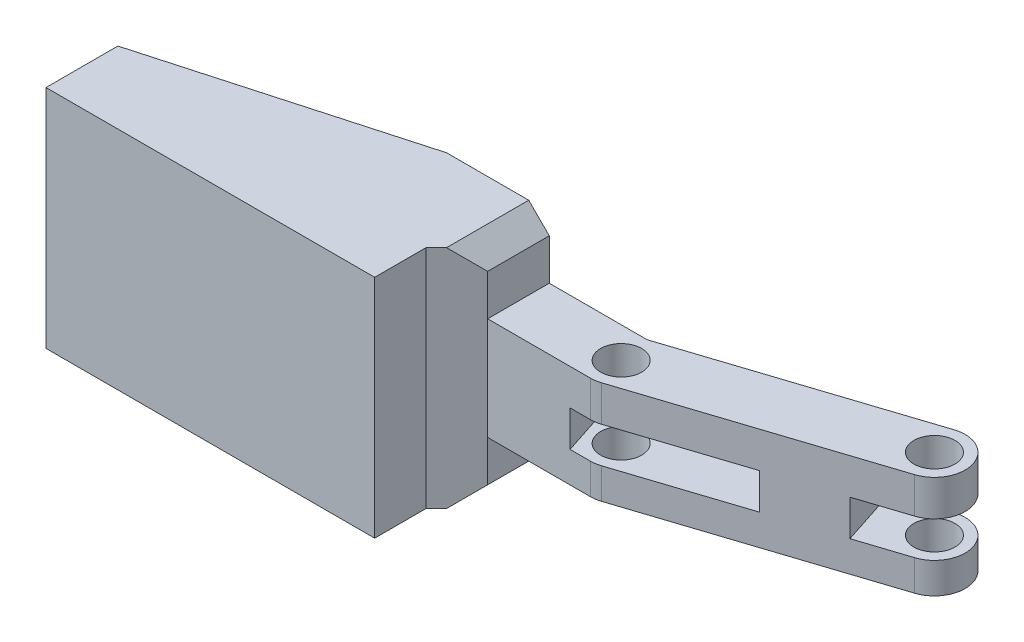
ISO-10303-21;
HEADER;
FILE_DESCRIPTION(('STEP AP214'),'2;1');
FILE_NAME('part.step','',(''),(''),'','','');
FILE_SCHEMA(('AUTOMOTIVE_DESIGN { 1 0 10303 214 1 1 1 1 }'));
ENDSEC;
DATA;
#1=APPLICATION_CONTEXT('core data for automotive mechanical design processes');
#2=APPLICATION_PROTOCOL_DEFINITION('international standard','automotive_design',2000,#1);
#3=PRODUCT_CONTEXT('',#1,'mechanical');
#4=PRODUCT('Part','Part','',(#3));
#5=PRODUCT_RELATED_PRODUCT_CATEGORY('part','',(#4));
#6=PRODUCT_DEFINITION_FORMATION('','',#4);
#7=PRODUCT_DEFINITION_CONTEXT('part definition',#1,'design');
#8=PRODUCT_DEFINITION('design','',#6,#7);
#9=PRODUCT_DEFINITION_SHAPE('','',#8);
#10=(LENGTH_UNIT() NAMED_UNIT(*) SI_UNIT(.MILLI.,.METRE.));
#11=(NAMED_UNIT(*) PLANE_ANGLE_UNIT() SI_UNIT($,.RADIAN.));
#12=(NAMED_UNIT(*) SI_UNIT($,.STERADIAN.) SOLID_ANGLE_UNIT());
#13=UNCERTAINTY_MEASURE_WITH_UNIT(LENGTH_MEASURE(1.E-05),#10,'distance_accuracy_value','');
#14=(GEOMETRIC_REPRESENTATION_CONTEXT(3) GLOBAL_UNCERTAINTY_ASSIGNED_CONTEXT((#13)) GLOBAL_UNIT_ASSIGNED_CONTEXT((#10,
#11,#12)) REPRESENTATION_CONTEXT('',''));
#15=CARTESIAN_POINT('',(0.,0.,0.));
#16=DIRECTION('',(0.,0.,1.));
#17=DIRECTION('',(1.,0.,0.));
#18=AXIS2_PLACEMENT_3D('',#15,#16,#17);
#19=CARTESIAN_POINT('',(-32.5,10.,3.75));
#20=DIRECTION('',(0.,1.,0.));
#21=DIRECTION('',(0.,0.,-1.));
#22=AXIS2_PLACEMENT_3D('',#19,#20,#21);
#23=PLANE('',#22);
#24=CARTESIAN_POINT('',(-23.,10.,7.5));
#25=DIRECTION('',(0.,1.,0.));
#26=DIRECTION('',(1.,0.,0.));
#27=AXIS2_PLACEMENT_3D('',#24,#25,#26);
#28=CIRCLE('',#27,2.);
#29=CARTESIAN_POINT('',(-25.,10.,7.5));
#30=VERTEX_POINT('',#29);
#31=EDGE_CURVE('E309',#30,#30,#28,.T.);
#32=ORIENTED_EDGE('',*,*,#31,.F.);
#33=EDGE_LOOP('',(#32));
#34=FACE_BOUND('',#33,.T.);
#35=CARTESIAN_POINT('',(0.,10.,0.));
#36=DIRECTION('',(0.,1.,0.));
#37=DIRECTION('',(1.,0.,0.));
#38=AXIS2_PLACEMENT_3D('',#35,#36,#37);
#39=CIRCLE('',#38,2.);
#40=CARTESIAN_POINT('',(-2.,10.,0.));
#41=VERTEX_POINT('',#40);
#42=EDGE_CURVE('E168',#41,#41,#39,.T.);
#43=ORIENTED_EDGE('',*,*,#42,.F.);
#44=EDGE_LOOP('',(#43));
#45=FACE_BOUND('',#44,.T.);
#46=DIRECTION('',(0.,0.,-1.));
#47=VECTOR('',#46,1.);
#48=CARTESIAN_POINT('',(-33.,10.,4.125));
#49=LINE('',#48,#47);
#50=CARTESIAN_POINT('',(-33.,10.,10.5));
#51=VERTEX_POINT('',#50);
#52=CARTESIAN_POINT('',(-33.,10.,4.5));
#53=VERTEX_POINT('',#52);
#54=EDGE_CURVE('E217',#51,#53,#49,.T.);
#55=ORIENTED_EDGE('',*,*,#54,.F.);
#56=DIRECTION('',(-1.,0.,0.));
#57=VECTOR('',#56,1.);
#58=CARTESIAN_POINT('',(-23.,10.,10.5));
#59=LINE('',#58,#57);
#60=CARTESIAN_POINT('',(-23.,10.,10.5));
#61=VERTEX_POINT('',#60);
#62=EDGE_CURVE('E272',#61,#51,#59,.T.);
#63=ORIENTED_EDGE('',*,*,#62,.F.);
#64=CARTESIAN_POINT('',(-23.,10.,7.5));
#65=DIRECTION('',(0.,-1.,0.));
#66=DIRECTION('',(0.,0.,-1.));
#67=AXIS2_PLACEMENT_3D('',#64,#65,#66);
#68=CIRCLE('',#67,3.);
#69=CARTESIAN_POINT('',(-22.0699382005073,10.,10.3521895184444));
#70=VERTEX_POINT('',#69);
#71=EDGE_CURVE('E287',#70,#61,#68,.T.);
#72=ORIENTED_EDGE('',*,*,#71,.F.);
#73=DIRECTION('',(-0.950729839481479,0.,0.310020599830917));
#74=VECTOR('',#73,1.);
#75=CARTESIAN_POINT('',(0.93006179949275,10.,2.85218951844443));
#76=LINE('',#75,#74);
#77=CARTESIAN_POINT('',(0.93006179949275,10.,2.85218951844443));
#78=VERTEX_POINT('',#77);
#79=EDGE_CURVE('E11',#78,#70,#76,.T.);
#80=ORIENTED_EDGE('',*,*,#79,.F.);
#81=CARTESIAN_POINT('',(0.,10.,0.));
#82=DIRECTION('',(0.,-1.,0.));
#83=DIRECTION('',(-0.310020599830917,0.,-0.950729839481479));
#84=AXIS2_PLACEMENT_3D('',#81,#82,#83);
#85=CIRCLE('',#84,3.);
#86=CARTESIAN_POINT('',(-0.93006179949275,10.,-2.85218951844443));
#87=VERTEX_POINT('',#86);
#88=EDGE_CURVE('E304',#87,#78,#85,.T.);
#89=ORIENTED_EDGE('',*,*,#88,.F.);
#90=DIRECTION('',(0.950729839481479,0.,-0.310020599830917));
#91=VECTOR('',#90,1.);
#92=CARTESIAN_POINT('',(-23.9300617994928,10.,4.64781048155556));
#93=LINE('',#92,#91);
#94=CARTESIAN_POINT('',(-23.4767763227223,10.,4.5));
#95=VERTEX_POINT('',#94);
#96=EDGE_CURVE('E299',#95,#87,#93,.T.);
#97=ORIENTED_EDGE('',*,*,#96,.F.);
#98=DIRECTION('',(1.,0.,0.));
#99=VECTOR('',#98,1.);
#100=CARTESIAN_POINT('',(-68.,10.,4.5));
#101=LINE('',#100,#99);
#102=EDGE_CURVE('E346',#53,#95,#101,.T.);
#103=ORIENTED_EDGE('',*,*,#102,.F.);
#104=EDGE_LOOP('',(#55,#63,#72,#80,#89,#97,#103));
#105=FACE_BOUND('',#104,.T.);
#106=ADVANCED_FACE('F50',(#34,#45,#105),#23,.T.);
#107=CARTESIAN_POINT('',(0.93006179949275,0.,2.85218951844443));
#108=DIRECTION('',(0.310020599830917,0.,0.950729839481479));
#109=DIRECTION('',(-0.950729839481479,0.,0.310020599830917));
#110=AXIS2_PLACEMENT_3D('',#107,#108,#109);
#111=PLANE('',#110);
#112=DIRECTION('',(-0.950729839481479,0.,0.310020599830917));
#113=VECTOR('',#112,1.);
#114=CARTESIAN_POINT('',(-4.77431723739612,6.5,4.71231311742994));
#115=LINE('',#114,#113);
#116=CARTESIAN_POINT('',(-10.478696274285,6.5,6.57243671641544));
#117=VERTEX_POINT('',#116);
#118=CARTESIAN_POINT('',(-22.0699382005073,6.5,10.3521895184444));
#119=VERTEX_POINT('',#118);
#120=EDGE_CURVE('E421',#117,#119,#115,.T.);
#121=ORIENTED_EDGE('',*,*,#120,.F.);
#122=DIRECTION('',(0.,1.,0.));
#123=VECTOR('',#122,1.);
#124=CARTESIAN_POINT('',(-10.478696274285,1.5,6.57243671641544));
#125=LINE('',#124,#123);
#126=CARTESIAN_POINT('',(-10.478696274285,3.,6.57243671641544));
#127=VERTEX_POINT('',#126);
#128=EDGE_CURVE('E381',#127,#117,#125,.T.);
#129=ORIENTED_EDGE('',*,*,#128,.F.);
#130=DIRECTION('',(0.950729839481479,0.,-0.310020599830917));
#131=VECTOR('',#130,1.);
#132=CARTESIAN_POINT('',(-11.9047910335072,3.,7.03746761616182));
#133=LINE('',#132,#131);
#134=CARTESIAN_POINT('',(-22.0699382005073,3.,10.3521895184444));
#135=VERTEX_POINT('',#134);
#136=EDGE_CURVE('E395',#135,#127,#133,.T.);
#137=ORIENTED_EDGE('',*,*,#136,.F.);
#138=DIRECTION('',(0.,1.,0.));
#139=VECTOR('',#138,1.);
#140=CARTESIAN_POINT('',(-22.0699382005073,0.,10.3521895184444));
#141=LINE('',#140,#139);
#142=CARTESIAN_POINT('',(-22.0699382005073,0.,10.3521895184444));
#143=VERTEX_POINT('',#142);
#144=EDGE_CURVE('E279',#143,#135,#141,.T.);
#145=ORIENTED_EDGE('',*,*,#144,.F.);
#146=DIRECTION('',(-0.950729839481479,0.,0.310020599830917));
#147=VECTOR('',#146,1.);
#148=CARTESIAN_POINT('',(0.93006179949275,0.,2.85218951844443));
#149=LINE('',#148,#147);
#150=CARTESIAN_POINT('',(0.93006179949275,0.,2.85218951844443));
#151=VERTEX_POINT('',#150);
#152=EDGE_CURVE('E231',#151,#143,#149,.T.);
#153=ORIENTED_EDGE('',*,*,#152,.F.);
#154=DIRECTION('',(0.,1.,0.));
#155=VECTOR('',#154,1.);
#156=CARTESIAN_POINT('',(0.93006179949275,0.,2.85218951844443));
#157=LINE('',#156,#155);
#158=CARTESIAN_POINT('',(0.930061799492751,3.,2.85218951844443));
#159=VERTEX_POINT('',#158);
#160=EDGE_CURVE('E60',#151,#159,#157,.T.);
#161=ORIENTED_EDGE('',*,*,#160,.T.);
#162=DIRECTION('',(0.950729839481479,0.,-0.310020599830917));
#163=VECTOR('',#162,1.);
#164=CARTESIAN_POINT('',(-1.44676279921095,3.,3.62724101802173));
#165=LINE('',#164,#163);
#166=CARTESIAN_POINT('',(-3.82358739791465,3.,4.40229251759902));
#167=VERTEX_POINT('',#166);
#168=EDGE_CURVE('E265',#167,#159,#165,.T.);
#169=ORIENTED_EDGE('',*,*,#168,.F.);
#170=DIRECTION('',(0.,-1.,0.));
#171=VECTOR('',#170,1.);
#172=CARTESIAN_POINT('',(-3.82358739791465,3.25,4.40229251759902));
#173=LINE('',#172,#171);
#174=CARTESIAN_POINT('',(-3.82358739791465,6.5,4.40229251759902));
#175=VERTEX_POINT('',#174);
#176=EDGE_CURVE('E344',#175,#167,#173,.T.);
#177=ORIENTED_EDGE('',*,*,#176,.F.);
#178=DIRECTION('',(-0.950729839481479,0.,0.310020599830917));
#179=VECTOR('',#178,1.);
#180=CARTESIAN_POINT('',(2.35615655871497,6.5,2.38715861869806));
#181=LINE('',#180,#179);
#182=CARTESIAN_POINT('',(0.930061799492752,6.5,2.85218951844443));
#183=VERTEX_POINT('',#182);
#184=EDGE_CURVE('E248',#183,#175,#181,.T.);
#185=ORIENTED_EDGE('',*,*,#184,.F.);
#186=DIRECTION('',(0.,1.,0.));
#187=VECTOR('',#186,1.);
#188=CARTESIAN_POINT('',(0.93006179949275,0.,2.85218951844443));
#189=LINE('',#188,#187);
#190=EDGE_CURVE('E302',#183,#78,#189,.T.);
#191=ORIENTED_EDGE('',*,*,#190,.T.);
#192=ORIENTED_EDGE('',*,*,#79,.T.);
#193=DIRECTION('',(0.,1.,0.));
#194=VECTOR('',#193,1.);
#195=CARTESIAN_POINT('',(-22.0699382005073,0.,10.3521895184444));
#196=LINE('',#195,#194);
#197=EDGE_CURVE('E292',#119,#70,#196,.T.);
#198=ORIENTED_EDGE('',*,*,#197,.F.);
#199=EDGE_LOOP('',(#121,#129,#137,#145,#153,#161,#169,#177,#185,#191,#192,#198));
#200=FACE_BOUND('',#199,.T.);
#201=ADVANCED_FACE('F447',(#200),#111,.T.);
#202=CARTESIAN_POINT('',(0.,0.,0.));
#203=DIRECTION('',(0.,-1.,0.));
#204=DIRECTION('',(-0.310020599830917,0.,-0.950729839481479));
#205=AXIS2_PLACEMENT_3D('',#202,#203,#204);
#206=CYLINDRICAL_SURFACE('',#205,3.);
#207=CARTESIAN_POINT('',(0.,3.,0.));
#208=DIRECTION('',(0.,1.,0.));
#209=DIRECTION('',(-0.310020599830917,0.,-0.950729839481479));
#210=AXIS2_PLACEMENT_3D('',#207,#208,#209);
#211=CIRCLE('',#210,3.);
#212=CARTESIAN_POINT('',(-0.93006179949275,3.,-2.85218951844443));
#213=VERTEX_POINT('',#212);
#214=EDGE_CURVE('E260',#159,#213,#211,.T.);
#215=ORIENTED_EDGE('',*,*,#214,.F.);
#216=ORIENTED_EDGE('',*,*,#160,.F.);
#217=CARTESIAN_POINT('',(0.,0.,0.));
#218=DIRECTION('',(0.,-1.,0.));
#219=DIRECTION('',(-0.310020599830917,0.,-0.950729839481479));
#220=AXIS2_PLACEMENT_3D('',#217,#218,#219);
#221=CIRCLE('',#220,3.);
#222=CARTESIAN_POINT('',(-0.93006179949275,0.,-2.85218951844443));
#223=VERTEX_POINT('',#222);
#224=EDGE_CURVE('E65',#223,#151,#221,.T.);
#225=ORIENTED_EDGE('',*,*,#224,.F.);
#226=DIRECTION('',(0.,1.,0.));
#227=VECTOR('',#226,1.);
#228=CARTESIAN_POINT('',(-0.93006179949275,0.,-2.85218951844443));
#229=LINE('',#228,#227);
#230=EDGE_CURVE('E295',#223,#213,#229,.T.);
#231=ORIENTED_EDGE('',*,*,#230,.T.);
#232=EDGE_LOOP('',(#215,#216,#225,#231));
#233=FACE_BOUND('',#232,.T.);
#234=ADVANCED_FACE('F641',(#233),#206,.T.);
#235=CARTESIAN_POINT('',(0.,0.,0.));
#236=DIRECTION('',(0.,-1.,0.));
#237=DIRECTION('',(1.,0.,0.));
#238=AXIS2_PLACEMENT_3D('',#235,#236,#237);
#239=CYLINDRICAL_SURFACE('',#238,2.);
#240=CARTESIAN_POINT('',(0.,0.,0.));
#241=DIRECTION('',(0.,1.,0.));
#242=DIRECTION('',(1.,0.,0.));
#243=AXIS2_PLACEMENT_3D('',#240,#241,#242);
#244=CIRCLE('',#243,2.);
#245=CARTESIAN_POINT('',(-2.,0.,0.));
#246=VERTEX_POINT('',#245);
#247=EDGE_CURVE('E226',#246,#246,#244,.T.);
#248=ORIENTED_EDGE('',*,*,#247,.F.);
#249=EDGE_LOOP('',(#248));
#250=FACE_BOUND('',#249,.T.);
#251=CARTESIAN_POINT('',(0.,3.,0.));
#252=DIRECTION('',(0.,-1.,0.));
#253=DIRECTION('',(1.,0.,0.));
#254=AXIS2_PLACEMENT_3D('',#251,#252,#253);
#255=CIRCLE('',#254,2.);
#256=CARTESIAN_POINT('',(-2.,3.,0.));
#257=VERTEX_POINT('',#256);
#258=EDGE_CURVE('E271',#257,#257,#255,.T.);
#259=ORIENTED_EDGE('',*,*,#258,.F.);
#260=EDGE_LOOP('',(#259));
#261=FACE_BOUND('',#260,.T.);
#262=ADVANCED_FACE('F677',(#250,#261),#239,.F.);
#263=CARTESIAN_POINT('',(-23.,0.,7.5));
#264=DIRECTION('',(0.,-1.,0.));
#265=DIRECTION('',(1.,0.,0.));
#266=AXIS2_PLACEMENT_3D('',#263,#264,#265);
#267=CYLINDRICAL_SURFACE('',#266,2.);
#268=CARTESIAN_POINT('',(-23.,0.,7.5));
#269=DIRECTION('',(0.,1.,0.));
#270=DIRECTION('',(1.,0.,0.));
#271=AXIS2_PLACEMENT_3D('',#268,#269,#270);
#272=CIRCLE('',#271,2.);
#273=CARTESIAN_POINT('',(-25.,0.,7.5));
#274=VERTEX_POINT('',#273);
#275=EDGE_CURVE('E173',#274,#274,#272,.T.);
#276=ORIENTED_EDGE('',*,*,#275,.F.);
#277=EDGE_LOOP('',(#276));
#278=FACE_BOUND('',#277,.T.);
#279=CARTESIAN_POINT('',(-23.,3.,7.5));
#280=DIRECTION('',(0.,-1.,0.));
#281=DIRECTION('',(1.,0.,0.));
#282=AXIS2_PLACEMENT_3D('',#279,#280,#281);
#283=CIRCLE('',#282,2.);
#284=CARTESIAN_POINT('',(-25.,3.,7.5));
#285=VERTEX_POINT('',#284);
#286=EDGE_CURVE('E388',#285,#285,#283,.T.);
#287=ORIENTED_EDGE('',*,*,#286,.F.);
#288=EDGE_LOOP('',(#287));
#289=FACE_BOUND('',#288,.T.);
#290=ADVANCED_FACE('F676',(#278,#289),#267,.F.);
#291=CARTESIAN_POINT('',(-68.,0.,13.5));
#292=DIRECTION('',(-1.,0.,0.));
#293=DIRECTION('',(0.,0.,-1.));
#294=AXIS2_PLACEMENT_3D('',#291,#292,#293);
#295=PLANE('',#294);
#296=DIRECTION('',(0.,-1.,0.));
#297=VECTOR('',#296,1.);
#298=CARTESIAN_POINT('',(-68.,0.,11.5));
#299=LINE('',#298,#297);
#300=CARTESIAN_POINT('',(-68.,16.,11.5));
#301=VERTEX_POINT('',#300);
#302=CARTESIAN_POINT('',(-68.,-6.,11.5));
#303=VERTEX_POINT('',#302);
#304=EDGE_CURVE('E49',#301,#303,#299,.T.);
#305=ORIENTED_EDGE('',*,*,#304,.T.);
#306=DIRECTION('',(0.,0.,1.));
#307=VECTOR('',#306,1.);
#308=CARTESIAN_POINT('',(-68.,-6.,13.5));
#309=LINE('',#308,#307);
#310=CARTESIAN_POINT('',(-68.,-6.,18.5));
#311=VERTEX_POINT('',#310);
#312=EDGE_CURVE('E552',#303,#311,#309,.T.);
#313=ORIENTED_EDGE('',*,*,#312,.T.);
#314=DIRECTION('',(0.,1.,0.));
#315=VECTOR('',#314,1.);
#316=CARTESIAN_POINT('',(-68.,-6.,18.5));
#317=LINE('',#316,#315);
#318=CARTESIAN_POINT('',(-68.,16.,18.5));
#319=VERTEX_POINT('',#318);
#320=EDGE_CURVE('E543',#311,#319,#317,.T.);
#321=ORIENTED_EDGE('',*,*,#320,.T.);
#322=DIRECTION('',(0.,0.,1.));
#323=VECTOR('',#322,1.);
#324=CARTESIAN_POINT('',(-68.,16.,13.5));
#325=LINE('',#324,#323);
#326=EDGE_CURVE('E368',#301,#319,#325,.T.);
#327=ORIENTED_EDGE('',*,*,#326,.F.);
#328=EDGE_LOOP('',(#305,#313,#321,#327));
#329=FACE_BOUND('',#328,.T.);
#330=ADVANCED_FACE('F621',(#329),#295,.T.);
#331=CARTESIAN_POINT('',(-55.5,0.,8.));
#332=DIRECTION('',(-0.269629925519971,0.,-0.962964019714182));
#333=DIRECTION('',(0.962964019714182,0.,-0.269629925519971));
#334=AXIS2_PLACEMENT_3D('',#331,#332,#333);
#335=PLANE('',#334);
#336=ORIENTED_EDGE('',*,*,#304,.F.);
#337=DIRECTION('',(0.962964019714182,0.,-0.269629925519971));
#338=VECTOR('',#337,1.);
#339=CARTESIAN_POINT('',(-68.,16.,11.5));
#340=LINE('',#339,#338);
#341=CARTESIAN_POINT('',(-43.,16.,4.5));
#342=VERTEX_POINT('',#341);
#343=EDGE_CURVE('E375',#301,#342,#340,.T.);
#344=ORIENTED_EDGE('',*,*,#343,.T.);
#345=DIRECTION('',(0.,-1.,0.));
#346=VECTOR('',#345,1.);
#347=CARTESIAN_POINT('',(-43.,10.,4.5));
#348=LINE('',#347,#346);
#349=CARTESIAN_POINT('',(-43.,-6.,4.5));
#350=VERTEX_POINT('',#349);
#351=EDGE_CURVE('E213',#342,#350,#348,.T.);
#352=ORIENTED_EDGE('',*,*,#351,.T.);
#353=DIRECTION('',(-0.962964019714182,0.,0.269629925519971));
#354=VECTOR('',#353,1.);
#355=CARTESIAN_POINT('',(-68.,-6.,11.5));
#356=LINE('',#355,#354);
#357=EDGE_CURVE('E533',#350,#303,#356,.T.);
#358=ORIENTED_EDGE('',*,*,#357,.T.);
#359=EDGE_LOOP('',(#336,#344,#352,#358));
#360=FACE_BOUND('',#359,.T.);
#361=ADVANCED_FACE('F627',(#360),#335,.T.);
#362=CARTESIAN_POINT('',(-34.5,0.,12.));
#363=DIRECTION('',(0.707106781186547,0.,0.707106781186548));
#364=DIRECTION('',(-0.707106781186548,0.,0.707106781186547));
#365=AXIS2_PLACEMENT_3D('',#362,#363,#364);
#366=PLANE('',#365);
#367=DIRECTION('',(0.577350269189628,0.577350269189623,-0.577350269189627));
#368=VECTOR('',#367,1.);
#369=CARTESIAN_POINT('',(-32.5416666666667,-3.54166666666668,10.0416666666667));
#370=LINE('',#369,#368);
#371=CARTESIAN_POINT('',(-35.,-6.,12.5));
#372=VERTEX_POINT('',#371);
#373=CARTESIAN_POINT('',(-33.,-4.,10.5));
#374=VERTEX_POINT('',#373);
#375=EDGE_CURVE('E522',#372,#374,#370,.T.);
#376=ORIENTED_EDGE('',*,*,#375,.T.);
#377=DIRECTION('',(0.,1.,0.));
#378=VECTOR('',#377,1.);
#379=CARTESIAN_POINT('',(-33.,10.,10.5));
#380=LINE('',#379,#378);
#381=CARTESIAN_POINT('',(-33.,0.,10.5));
#382=VERTEX_POINT('',#381);
#383=EDGE_CURVE('E315',#374,#382,#380,.T.);
#384=ORIENTED_EDGE('',*,*,#383,.T.);
#385=DIRECTION('',(0.,1.,0.));
#386=VECTOR('',#385,1.);
#387=CARTESIAN_POINT('',(-33.,0.,10.5));
#388=LINE('',#387,#386);
#389=EDGE_CURVE('E220',#382,#51,#388,.T.);
#390=ORIENTED_EDGE('',*,*,#389,.T.);
#391=DIRECTION('',(0.,1.,0.));
#392=VECTOR('',#391,1.);
#393=CARTESIAN_POINT('',(-33.,10.,10.5));
#394=LINE('',#393,#392);
#395=CARTESIAN_POINT('',(-33.,14.,10.5));
#396=VERTEX_POINT('',#395);
#397=EDGE_CURVE('E197',#51,#396,#394,.T.);
#398=ORIENTED_EDGE('',*,*,#397,.T.);
#399=DIRECTION('',(-0.577350269189628,0.577350269189623,0.577350269189627));
#400=VECTOR('',#399,1.);
#401=CARTESIAN_POINT('',(-30.875,11.875,8.375));
#402=LINE('',#401,#400);
#403=CARTESIAN_POINT('',(-35.,16.,12.5));
#404=VERTEX_POINT('',#403);
#405=EDGE_CURVE('E206',#396,#404,#402,.T.);
#406=ORIENTED_EDGE('',*,*,#405,.T.);
#407=DIRECTION('',(-0.707106781186547,0.,0.707106781186548));
#408=VECTOR('',#407,1.);
#409=CARTESIAN_POINT('',(-33.,16.,10.5));
#410=LINE('',#409,#408);
#411=CARTESIAN_POINT('',(-36.,16.,13.5));
#412=VERTEX_POINT('',#411);
#413=EDGE_CURVE('E205',#404,#412,#410,.T.);
#414=ORIENTED_EDGE('',*,*,#413,.T.);
#415=DIRECTION('',(0.,1.,0.));
#416=VECTOR('',#415,1.);
#417=CARTESIAN_POINT('',(-36.,10.,13.5));
#418=LINE('',#417,#416);
#419=CARTESIAN_POINT('',(-36.,-6.,13.5));
#420=VERTEX_POINT('',#419);
#421=EDGE_CURVE('E594',#420,#412,#418,.T.);
#422=ORIENTED_EDGE('',*,*,#421,.F.);
#423=DIRECTION('',(0.707106781186547,0.,-0.707106781186548));
#424=VECTOR('',#423,1.);
#425=CARTESIAN_POINT('',(-33.,-6.,10.5));
#426=LINE('',#425,#424);
#427=EDGE_CURVE('E547',#420,#372,#426,.T.);
#428=ORIENTED_EDGE('',*,*,#427,.T.);
#429=EDGE_LOOP('',(#376,#384,#390,#398,#406,#414,#422,#428));
#430=FACE_BOUND('',#429,.T.);
#431=ADVANCED_FACE('F215',(#430),#366,.T.);
#432=CARTESIAN_POINT('',(-32.5,0.,3.75));
#433=DIRECTION('',(0.,1.,0.));
#434=DIRECTION('',(0.,0.,-1.));
#435=AXIS2_PLACEMENT_3D('',#432,#433,#434);
#436=PLANE('',#435);
#437=DIRECTION('',(0.,0.,1.));
#438=VECTOR('',#437,1.);
#439=CARTESIAN_POINT('',(-33.,0.,4.125));
#440=LINE('',#439,#438);
#441=CARTESIAN_POINT('',(-33.,0.,4.50000000000006));
#442=VERTEX_POINT('',#441);
#443=EDGE_CURVE('E228',#442,#382,#440,.T.);
#444=ORIENTED_EDGE('',*,*,#443,.F.);
#445=DIRECTION('',(1.,0.,0.));
#446=VECTOR('',#445,1.);
#447=CARTESIAN_POINT('',(-68.,0.,4.5));
#448=LINE('',#447,#446);
#449=CARTESIAN_POINT('',(-23.4767763227223,0.,4.5));
#450=VERTEX_POINT('',#449);
#451=EDGE_CURVE('E324',#442,#450,#448,.T.);
#452=ORIENTED_EDGE('',*,*,#451,.T.);
#453=DIRECTION('',(0.950729839481479,0.,-0.310020599830917));
#454=VECTOR('',#453,1.);
#455=CARTESIAN_POINT('',(-23.9300617994928,0.,4.64781048155556));
#456=LINE('',#455,#454);
#457=EDGE_CURVE('E297',#450,#223,#456,.T.);
#458=ORIENTED_EDGE('',*,*,#457,.T.);
#459=ORIENTED_EDGE('',*,*,#224,.T.);
#460=ORIENTED_EDGE('',*,*,#152,.T.);
#461=CARTESIAN_POINT('',(-23.,0.,7.5));
#462=DIRECTION('',(0.,-1.,0.));
#463=DIRECTION('',(0.,0.,-1.));
#464=AXIS2_PLACEMENT_3D('',#461,#462,#463);
#465=CIRCLE('',#464,3.);
#466=CARTESIAN_POINT('',(-23.,0.,10.5));
#467=VERTEX_POINT('',#466);
#468=EDGE_CURVE('E281',#143,#467,#465,.T.);
#469=ORIENTED_EDGE('',*,*,#468,.T.);
#470=DIRECTION('',(-1.,0.,0.));
#471=VECTOR('',#470,1.);
#472=CARTESIAN_POINT('',(-23.,0.,10.5));
#473=LINE('',#472,#471);
#474=EDGE_CURVE('E269',#467,#382,#473,.T.);
#475=ORIENTED_EDGE('',*,*,#474,.T.);
#476=EDGE_LOOP('',(#444,#452,#458,#459,#460,#469,#475));
#477=FACE_BOUND('',#476,.T.);
#478=ORIENTED_EDGE('',*,*,#247,.T.);
#479=EDGE_LOOP('',(#478));
#480=FACE_BOUND('',#479,.T.);
#481=ORIENTED_EDGE('',*,*,#275,.T.);
#482=EDGE_LOOP('',(#481));
#483=FACE_BOUND('',#482,.T.);
#484=ADVANCED_FACE('F585',(#477,#480,#483),#436,.F.);
#485=CARTESIAN_POINT('',(-33.,10.,4.50000000000006));
#486=DIRECTION('',(1.,0.,0.));
#487=DIRECTION('',(0.,0.,1.));
#488=AXIS2_PLACEMENT_3D('',#485,#486,#487);
#489=PLANE('',#488);
#490=DIRECTION('',(0.,0.,1.));
#491=VECTOR('',#490,1.);
#492=CARTESIAN_POINT('',(-33.,14.,6.75000000000009));
#493=LINE('',#492,#491);
#494=CARTESIAN_POINT('',(-33.,14.,4.50000000000006));
#495=VERTEX_POINT('',#494);
#496=EDGE_CURVE('E195',#495,#396,#493,.T.);
#497=ORIENTED_EDGE('',*,*,#496,.T.);
#498=ORIENTED_EDGE('',*,*,#397,.F.);
#499=ORIENTED_EDGE('',*,*,#54,.T.);
#500=DIRECTION('',(0.,1.,0.));
#501=VECTOR('',#500,1.);
#502=CARTESIAN_POINT('',(-33.,10.,4.50000000000006));
#503=LINE('',#502,#501);
#504=EDGE_CURVE('E200',#53,#495,#503,.T.);
#505=ORIENTED_EDGE('',*,*,#504,.T.);
#506=EDGE_LOOP('',(#497,#498,#499,#505));
#507=FACE_BOUND('',#506,.T.);
#508=ADVANCED_FACE('F191',(#507),#489,.T.);
#509=CARTESIAN_POINT('',(-33.,10.,4.50000000000006));
#510=DIRECTION('',(1.,0.,0.));
#511=DIRECTION('',(0.,0.,1.));
#512=AXIS2_PLACEMENT_3D('',#509,#510,#511);
#513=PLANE('',#512);
#514=DIRECTION('',(0.,0.,-1.));
#515=VECTOR('',#514,1.);
#516=CARTESIAN_POINT('',(-33.,-4.,6.75000000000009));
#517=LINE('',#516,#515);
#518=CARTESIAN_POINT('',(-33.,-4.,4.50000000000006));
#519=VERTEX_POINT('',#518);
#520=EDGE_CURVE('E534',#374,#519,#517,.T.);
#521=ORIENTED_EDGE('',*,*,#520,.T.);
#522=DIRECTION('',(0.,1.,0.));
#523=VECTOR('',#522,1.);
#524=CARTESIAN_POINT('',(-33.,10.,4.50000000000006));
#525=LINE('',#524,#523);
#526=EDGE_CURVE('E540',#519,#442,#525,.T.);
#527=ORIENTED_EDGE('',*,*,#526,.T.);
#528=ORIENTED_EDGE('',*,*,#443,.T.);
#529=ORIENTED_EDGE('',*,*,#383,.F.);
#530=EDGE_LOOP('',(#521,#527,#528,#529));
#531=FACE_BOUND('',#530,.T.);
#532=ADVANCED_FACE('F660',(#531),#513,.T.);
#533=CARTESIAN_POINT('',(0.,0.,0.));
#534=DIRECTION('',(0.,-1.,0.));
#535=DIRECTION('',(1.,0.,0.));
#536=AXIS2_PLACEMENT_3D('',#533,#534,#535);
#537=CYLINDRICAL_SURFACE('',#536,2.);
#538=CARTESIAN_POINT('',(0.,6.5,0.));
#539=DIRECTION('',(0.,1.,0.));
#540=DIRECTION('',(1.,0.,0.));
#541=AXIS2_PLACEMENT_3D('',#538,#539,#540);
#542=CIRCLE('',#541,2.);
#543=CARTESIAN_POINT('',(-2.,6.5,0.));
#544=VERTEX_POINT('',#543);
#545=EDGE_CURVE('E250',#544,#544,#542,.T.);
#546=ORIENTED_EDGE('',*,*,#545,.F.);
#547=EDGE_LOOP('',(#546));
#548=FACE_BOUND('',#547,.T.);
#549=ORIENTED_EDGE('',*,*,#42,.T.);
#550=EDGE_LOOP('',(#549));
#551=FACE_BOUND('',#550,.T.);
#552=ADVANCED_FACE('F652',(#548,#551),#537,.F.);
#553=CARTESIAN_POINT('',(-23.,0.,7.5));
#554=DIRECTION('',(0.,-1.,0.));
#555=DIRECTION('',(1.,0.,0.));
#556=AXIS2_PLACEMENT_3D('',#553,#554,#555);
#557=CYLINDRICAL_SURFACE('',#556,2.);
#558=CARTESIAN_POINT('',(-23.,6.5,7.5));
#559=DIRECTION('',(0.,1.,0.));
#560=DIRECTION('',(1.,0.,0.));
#561=AXIS2_PLACEMENT_3D('',#558,#559,#560);
#562=CIRCLE('',#561,2.);
#563=CARTESIAN_POINT('',(-25.,6.5,7.5));
#564=VERTEX_POINT('',#563);
#565=EDGE_CURVE('E423',#564,#564,#562,.T.);
#566=ORIENTED_EDGE('',*,*,#565,.F.);
#567=EDGE_LOOP('',(#566));
#568=FACE_BOUND('',#567,.T.);
#569=ORIENTED_EDGE('',*,*,#31,.T.);
#570=EDGE_LOOP('',(#569));
#571=FACE_BOUND('',#570,.T.);
#572=ADVANCED_FACE('F649',(#568,#571),#557,.F.);
#573=CARTESIAN_POINT('',(0.,0.,0.));
#574=DIRECTION('',(0.,-1.,0.));
#575=DIRECTION('',(-0.310020599830917,0.,-0.950729839481479));
#576=AXIS2_PLACEMENT_3D('',#573,#574,#575);
#577=CYLINDRICAL_SURFACE('',#576,3.);
#578=CARTESIAN_POINT('',(0.,6.5,0.));
#579=DIRECTION('',(0.,-1.,0.));
#580=DIRECTION('',(-0.310020599830917,0.,-0.950729839481479));
#581=AXIS2_PLACEMENT_3D('',#578,#579,#580);
#582=CIRCLE('',#581,3.);
#583=CARTESIAN_POINT('',(-0.93006179949275,6.5,-2.85218951844443));
#584=VERTEX_POINT('',#583);
#585=EDGE_CURVE('E253',#584,#183,#582,.T.);
#586=ORIENTED_EDGE('',*,*,#585,.F.);
#587=DIRECTION('',(0.,1.,0.));
#588=VECTOR('',#587,1.);
#589=CARTESIAN_POINT('',(-0.93006179949275,0.,-2.85218951844443));
#590=LINE('',#589,#588);
#591=EDGE_CURVE('E296',#584,#87,#590,.T.);
#592=ORIENTED_EDGE('',*,*,#591,.T.);
#593=ORIENTED_EDGE('',*,*,#88,.T.);
#594=ORIENTED_EDGE('',*,*,#190,.F.);
#595=EDGE_LOOP('',(#586,#592,#593,#594));
#596=FACE_BOUND('',#595,.T.);
#597=ADVANCED_FACE('F650',(#596),#577,.T.);
#598=CARTESIAN_POINT('',(-23.4767763227223,0.,4.5));
#599=DIRECTION('',(-0.310020599830917,0.,-0.950729839481479));
#600=DIRECTION('',(0.950729839481479,0.,-0.310020599830917));
#601=AXIS2_PLACEMENT_3D('',#598,#599,#600);
#602=PLANE('',#601);
#603=DIRECTION('',(0.950729839481479,0.,-0.310020599830917));
#604=VECTOR('',#603,1.);
#605=CARTESIAN_POINT('',(-17.9077980979965,6.5,2.68402883976328));
#606=LINE('',#605,#604);
#607=CARTESIAN_POINT('',(-23.4767763227223,6.5,4.5));
#608=VERTEX_POINT('',#607);
#609=CARTESIAN_POINT('',(-12.3388198732705,6.5,0.868057679526567));
#610=VERTEX_POINT('',#609);
#611=EDGE_CURVE('E415',#608,#610,#606,.T.);
#612=ORIENTED_EDGE('',*,*,#611,.F.);
#613=DIRECTION('',(0.,1.,0.));
#614=VECTOR('',#613,1.);
#615=CARTESIAN_POINT('',(-23.4767763227223,0.,4.5));
#616=LINE('',#615,#614);
#617=EDGE_CURVE('E336',#608,#95,#616,.T.);
#618=ORIENTED_EDGE('',*,*,#617,.T.);
#619=ORIENTED_EDGE('',*,*,#96,.T.);
#620=ORIENTED_EDGE('',*,*,#591,.F.);
#621=DIRECTION('',(0.950729839481479,0.,-0.310020599830917));
#622=VECTOR('',#621,1.);
#623=CARTESIAN_POINT('',(-10.7773243018853,6.5,0.358874341031408));
#624=LINE('',#623,#622);
#625=CARTESIAN_POINT('',(-5.68371099690015,6.5,-1.30208651928985));
#626=VERTEX_POINT('',#625);
#627=EDGE_CURVE('E249',#626,#584,#624,.T.);
#628=ORIENTED_EDGE('',*,*,#627,.F.);
#629=DIRECTION('',(0.,1.,0.));
#630=VECTOR('',#629,1.);
#631=CARTESIAN_POINT('',(-5.68371099690015,3.25,-1.30208651928985));
#632=LINE('',#631,#630);
#633=CARTESIAN_POINT('',(-5.68371099690015,3.,-1.30208651928985));
#634=VERTEX_POINT('',#633);
#635=EDGE_CURVE('E343',#634,#626,#632,.T.);
#636=ORIENTED_EDGE('',*,*,#635,.F.);
#637=DIRECTION('',(-0.950729839481479,0.,0.310020599830917));
#638=VECTOR('',#637,1.);
#639=CARTESIAN_POINT('',(-14.5802436598112,3.,1.59895674035507));
#640=LINE('',#639,#638);
#641=EDGE_CURVE('E258',#213,#634,#640,.T.);
#642=ORIENTED_EDGE('',*,*,#641,.F.);
#643=ORIENTED_EDGE('',*,*,#230,.F.);
#644=ORIENTED_EDGE('',*,*,#457,.F.);
#645=DIRECTION('',(0.,1.,0.));
#646=VECTOR('',#645,1.);
#647=CARTESIAN_POINT('',(-23.4767763227223,0.,4.5));
#648=LINE('',#647,#646);
#649=CARTESIAN_POINT('',(-23.4767763227223,3.,4.5));
#650=VERTEX_POINT('',#649);
#651=EDGE_CURVE('E330',#450,#650,#648,.T.);
#652=ORIENTED_EDGE('',*,*,#651,.T.);
#653=DIRECTION('',(-0.950729839481479,0.,0.310020599830917));
#654=VECTOR('',#653,1.);
#655=CARTESIAN_POINT('',(-25.0382718941075,3.,5.00918333849516));
#656=LINE('',#655,#654);
#657=CARTESIAN_POINT('',(-12.3388198732705,3.,0.868057679526567));
#658=VERTEX_POINT('',#657);
#659=EDGE_CURVE('E393',#658,#650,#656,.T.);
#660=ORIENTED_EDGE('',*,*,#659,.F.);
#661=DIRECTION('',(0.,-1.,0.));
#662=VECTOR('',#661,1.);
#663=CARTESIAN_POINT('',(-12.3388198732705,1.5,0.868057679526569));
#664=LINE('',#663,#662);
#665=EDGE_CURVE('E376',#610,#658,#664,.T.);
#666=ORIENTED_EDGE('',*,*,#665,.F.);
#667=EDGE_LOOP('',(#612,#618,#619,#620,#628,#636,#642,#643,#644,#652,#660,#666));
#668=FACE_BOUND('',#667,.T.);
#669=ADVANCED_FACE('F436',(#668),#602,.T.);
#670=CARTESIAN_POINT('',(-23.,0.,7.5));
#671=DIRECTION('',(0.,-1.,0.));
#672=DIRECTION('',(0.,0.,-1.));
#673=AXIS2_PLACEMENT_3D('',#670,#671,#672);
#674=CYLINDRICAL_SURFACE('',#673,3.);
#675=CARTESIAN_POINT('',(-23.,6.5,7.5));
#676=DIRECTION('',(0.,-1.,0.));
#677=DIRECTION('',(0.,0.,-1.));
#678=AXIS2_PLACEMENT_3D('',#675,#676,#677);
#679=CIRCLE('',#678,3.);
#680=CARTESIAN_POINT('',(-23.,6.5,10.5));
#681=VERTEX_POINT('',#680);
#682=EDGE_CURVE('E419',#119,#681,#679,.T.);
#683=ORIENTED_EDGE('',*,*,#682,.F.);
#684=ORIENTED_EDGE('',*,*,#197,.T.);
#685=ORIENTED_EDGE('',*,*,#71,.T.);
#686=DIRECTION('',(0.,1.,0.));
#687=VECTOR('',#686,1.);
#688=CARTESIAN_POINT('',(-23.,0.,10.5));
#689=LINE('',#688,#687);
#690=EDGE_CURVE('E280',#681,#61,#689,.T.);
#691=ORIENTED_EDGE('',*,*,#690,.F.);
#692=EDGE_LOOP('',(#683,#684,#685,#691));
#693=FACE_BOUND('',#692,.T.);
#694=ADVANCED_FACE('F704',(#693),#674,.T.);
#695=CARTESIAN_POINT('',(-23.,0.,7.5));
#696=DIRECTION('',(0.,-1.,0.));
#697=DIRECTION('',(0.,0.,-1.));
#698=AXIS2_PLACEMENT_3D('',#695,#696,#697);
#699=CYLINDRICAL_SURFACE('',#698,3.);
#700=CARTESIAN_POINT('',(-23.,3.,7.5));
#701=DIRECTION('',(0.,1.,0.));
#702=DIRECTION('',(0.,0.,-1.));
#703=AXIS2_PLACEMENT_3D('',#700,#701,#702);
#704=CIRCLE('',#703,3.);
#705=CARTESIAN_POINT('',(-23.,3.,10.5));
#706=VERTEX_POINT('',#705);
#707=EDGE_CURVE('E400',#706,#135,#704,.T.);
#708=ORIENTED_EDGE('',*,*,#707,.F.);
#709=DIRECTION('',(0.,1.,0.));
#710=VECTOR('',#709,1.);
#711=CARTESIAN_POINT('',(-23.,0.,10.5));
#712=LINE('',#711,#710);
#713=EDGE_CURVE('E266',#467,#706,#712,.T.);
#714=ORIENTED_EDGE('',*,*,#713,.F.);
#715=ORIENTED_EDGE('',*,*,#468,.F.);
#716=ORIENTED_EDGE('',*,*,#144,.T.);
#717=EDGE_LOOP('',(#708,#714,#715,#716));
#718=FACE_BOUND('',#717,.T.);
#719=ADVANCED_FACE('F571',(#718),#699,.T.);
#720=CARTESIAN_POINT('',(-23.,0.,10.5));
#721=DIRECTION('',(0.,0.,1.));
#722=DIRECTION('',(-1.,0.,0.));
#723=AXIS2_PLACEMENT_3D('',#720,#721,#722);
#724=PLANE('',#723);
#725=DIRECTION('',(-1.,0.,0.));
#726=VECTOR('',#725,1.);
#727=CARTESIAN_POINT('',(-16.7393481371425,6.5,10.5));
#728=LINE('',#727,#726);
#729=CARTESIAN_POINT('',(-24.9753218166852,6.5,10.5));
#730=VERTEX_POINT('',#729);
#731=EDGE_CURVE('E414',#681,#730,#728,.T.);
#732=ORIENTED_EDGE('',*,*,#731,.F.);
#733=ORIENTED_EDGE('',*,*,#690,.T.);
#734=ORIENTED_EDGE('',*,*,#62,.T.);
#735=ORIENTED_EDGE('',*,*,#389,.F.);
#736=ORIENTED_EDGE('',*,*,#474,.F.);
#737=ORIENTED_EDGE('',*,*,#713,.T.);
#738=DIRECTION('',(1.,0.,0.));
#739=VECTOR('',#738,1.);
#740=CARTESIAN_POINT('',(-23.8698219332536,3.,10.5));
#741=LINE('',#740,#739);
#742=CARTESIAN_POINT('',(-24.9753218166852,3.,10.5));
#743=VERTEX_POINT('',#742);
#744=EDGE_CURVE('E401',#743,#706,#741,.T.);
#745=ORIENTED_EDGE('',*,*,#744,.F.);
#746=DIRECTION('',(0.,-1.,0.));
#747=VECTOR('',#746,1.);
#748=CARTESIAN_POINT('',(-24.9753218166852,3.25,10.5));
#749=LINE('',#748,#747);
#750=EDGE_CURVE('E406',#730,#743,#749,.T.);
#751=ORIENTED_EDGE('',*,*,#750,.F.);
#752=EDGE_LOOP('',(#732,#733,#734,#735,#736,#737,#745,#751));
#753=FACE_BOUND('',#752,.T.);
#754=ADVANCED_FACE('F564',(#753),#724,.T.);
#755=CARTESIAN_POINT('',(-3.82358739791465,3.,4.40229251759902));
#756=DIRECTION('',(0.,-1.,0.));
#757=DIRECTION('',(0.950729839481479,0.,-0.310020599830917));
#758=AXIS2_PLACEMENT_3D('',#755,#756,#757);
#759=PLANE('',#758);
#760=ORIENTED_EDGE('',*,*,#258,.T.);
#761=EDGE_LOOP('',(#760));
#762=FACE_BOUND('',#761,.T.);
#763=ORIENTED_EDGE('',*,*,#641,.T.);
#764=DIRECTION('',(-0.310020599830917,0.,-0.950729839481479));
#765=VECTOR('',#764,1.);
#766=CARTESIAN_POINT('',(-3.82358739791465,3.,4.40229251759902));
#767=LINE('',#766,#765);
#768=EDGE_CURVE('E338',#167,#634,#767,.T.);
#769=ORIENTED_EDGE('',*,*,#768,.F.);
#770=ORIENTED_EDGE('',*,*,#168,.T.);
#771=ORIENTED_EDGE('',*,*,#214,.T.);
#772=EDGE_LOOP('',(#763,#769,#770,#771));
#773=FACE_BOUND('',#772,.T.);
#774=ADVANCED_FACE('F691',(#762,#773),#759,.F.);
#775=CARTESIAN_POINT('',(3.78225131793719,6.5,1.92212771895168));
#776=DIRECTION('',(0.,1.,0.));
#777=DIRECTION('',(-0.950729839481479,0.,0.310020599830917));
#778=AXIS2_PLACEMENT_3D('',#775,#776,#777);
#779=PLANE('',#778);
#780=ORIENTED_EDGE('',*,*,#627,.T.);
#781=ORIENTED_EDGE('',*,*,#585,.T.);
#782=ORIENTED_EDGE('',*,*,#184,.T.);
#783=DIRECTION('',(-0.310020599830917,0.,-0.950729839481479));
#784=VECTOR('',#783,1.);
#785=CARTESIAN_POINT('',(-3.82358739791465,6.5,4.40229251759902));
#786=LINE('',#785,#784);
#787=EDGE_CURVE('E353',#175,#626,#786,.T.);
#788=ORIENTED_EDGE('',*,*,#787,.T.);
#789=EDGE_LOOP('',(#780,#781,#782,#788));
#790=FACE_BOUND('',#789,.T.);
#791=ORIENTED_EDGE('',*,*,#545,.T.);
#792=EDGE_LOOP('',(#791));
#793=FACE_BOUND('',#792,.T.);
#794=ADVANCED_FACE('F443',(#790,#793),#779,.F.);
#795=CARTESIAN_POINT('',(-3.82358739791465,6.5,4.40229251759902));
#796=DIRECTION('',(-0.950729839481479,0.,0.310020599830917));
#797=DIRECTION('',(0.,-1.,0.));
#798=AXIS2_PLACEMENT_3D('',#795,#796,#797);
#799=PLANE('',#798);
#800=ORIENTED_EDGE('',*,*,#635,.T.);
#801=ORIENTED_EDGE('',*,*,#787,.F.);
#802=ORIENTED_EDGE('',*,*,#176,.T.);
#803=ORIENTED_EDGE('',*,*,#768,.T.);
#804=EDGE_LOOP('',(#800,#801,#802,#803));
#805=FACE_BOUND('',#804,.T.);
#806=ADVANCED_FACE('F428',(#805),#799,.F.);
#807=CARTESIAN_POINT('',(-10.478696274285,6.5,6.57243671641544));
#808=DIRECTION('',(0.,1.,0.));
#809=DIRECTION('',(-0.950729839481479,0.,0.310020599830917));
#810=AXIS2_PLACEMENT_3D('',#807,#808,#809);
#811=PLANE('',#810);
#812=ORIENTED_EDGE('',*,*,#565,.T.);
#813=EDGE_LOOP('',(#812));
#814=FACE_BOUND('',#813,.T.);
#815=ORIENTED_EDGE('',*,*,#611,.T.);
#816=DIRECTION('',(-0.310020599830917,0.,-0.950729839481479));
#817=VECTOR('',#816,1.);
#818=CARTESIAN_POINT('',(-10.478696274285,6.5,6.57243671641544));
#819=LINE('',#818,#817);
#820=EDGE_CURVE('E380',#117,#610,#819,.T.);
#821=ORIENTED_EDGE('',*,*,#820,.F.);
#822=ORIENTED_EDGE('',*,*,#120,.T.);
#823=ORIENTED_EDGE('',*,*,#682,.T.);
#824=ORIENTED_EDGE('',*,*,#731,.T.);
#825=DIRECTION('',(-0.310020599830917,0.,-0.950729839481479));
#826=VECTOR('',#825,1.);
#827=CARTESIAN_POINT('',(-24.7396438665072,6.5,11.2227457138792));
#828=LINE('',#827,#826);
#829=CARTESIAN_POINT('',(-26.9318435558156,6.5,4.5));
#830=VERTEX_POINT('',#829);
#831=EDGE_CURVE('E407',#730,#830,#828,.T.);
#832=ORIENTED_EDGE('',*,*,#831,.T.);
#833=DIRECTION('',(1.,0.,0.));
#834=VECTOR('',#833,1.);
#835=CARTESIAN_POINT('',(-39.2393481371425,6.5,4.5));
#836=LINE('',#835,#834);
#837=EDGE_CURVE('E337',#830,#608,#836,.T.);
#838=ORIENTED_EDGE('',*,*,#837,.T.);
#839=EDGE_LOOP('',(#815,#821,#822,#823,#824,#832,#838));
#840=FACE_BOUND('',#839,.T.);
#841=ADVANCED_FACE('F565',(#814,#840),#811,.F.);
#842=CARTESIAN_POINT('',(-24.7396438665072,6.5,11.2227457138792));
#843=DIRECTION('',(-0.950729839481479,0.,0.310020599830917));
#844=DIRECTION('',(0.,-1.,0.));
#845=AXIS2_PLACEMENT_3D('',#842,#843,#844);
#846=PLANE('',#845);
#847=DIRECTION('',(0.,1.,0.));
#848=VECTOR('',#847,1.);
#849=CARTESIAN_POINT('',(-26.9318435558156,3.25,4.5));
#850=LINE('',#849,#848);
#851=CARTESIAN_POINT('',(-26.9318435558156,3.,4.5));
#852=VERTEX_POINT('',#851);
#853=EDGE_CURVE('E334',#852,#830,#850,.T.);
#854=ORIENTED_EDGE('',*,*,#853,.T.);
#855=ORIENTED_EDGE('',*,*,#831,.F.);
#856=ORIENTED_EDGE('',*,*,#750,.T.);
#857=DIRECTION('',(-0.310020599830917,0.,-0.950729839481479));
#858=VECTOR('',#857,1.);
#859=CARTESIAN_POINT('',(-24.7396438665072,3.,11.2227457138792));
#860=LINE('',#859,#858);
#861=EDGE_CURVE('E404',#743,#852,#860,.T.);
#862=ORIENTED_EDGE('',*,*,#861,.T.);
#863=EDGE_LOOP('',(#854,#855,#856,#862));
#864=FACE_BOUND('',#863,.T.);
#865=ADVANCED_FACE('F559',(#864),#846,.F.);
#866=CARTESIAN_POINT('',(-24.7396438665072,3.,11.2227457138792));
#867=DIRECTION('',(0.,-1.,0.));
#868=DIRECTION('',(0.950729839481479,0.,-0.310020599830917));
#869=AXIS2_PLACEMENT_3D('',#866,#867,#868);
#870=PLANE('',#869);
#871=ORIENTED_EDGE('',*,*,#659,.T.);
#872=DIRECTION('',(-1.,0.,0.));
#873=VECTOR('',#872,1.);
#874=CARTESIAN_POINT('',(-46.3698219332536,3.,4.5));
#875=LINE('',#874,#873);
#876=EDGE_CURVE('E328',#650,#852,#875,.T.);
#877=ORIENTED_EDGE('',*,*,#876,.T.);
#878=ORIENTED_EDGE('',*,*,#861,.F.);
#879=ORIENTED_EDGE('',*,*,#744,.T.);
#880=ORIENTED_EDGE('',*,*,#707,.T.);
#881=ORIENTED_EDGE('',*,*,#136,.T.);
#882=DIRECTION('',(-0.310020599830917,0.,-0.950729839481479));
#883=VECTOR('',#882,1.);
#884=CARTESIAN_POINT('',(-10.478696274285,3.,6.57243671641544));
#885=LINE('',#884,#883);
#886=EDGE_CURVE('E386',#127,#658,#885,.T.);
#887=ORIENTED_EDGE('',*,*,#886,.T.);
#888=EDGE_LOOP('',(#871,#877,#878,#879,#880,#881,#887));
#889=FACE_BOUND('',#888,.T.);
#890=ORIENTED_EDGE('',*,*,#286,.T.);
#891=EDGE_LOOP('',(#890));
#892=FACE_BOUND('',#891,.T.);
#893=ADVANCED_FACE('F569',(#889,#892),#870,.F.);
#894=CARTESIAN_POINT('',(-10.478696274285,3.,6.57243671641544));
#895=DIRECTION('',(0.950729839481479,0.,-0.310020599830917));
#896=DIRECTION('',(0.,1.,0.));
#897=AXIS2_PLACEMENT_3D('',#894,#895,#896);
#898=PLANE('',#897);
#899=ORIENTED_EDGE('',*,*,#665,.T.);
#900=ORIENTED_EDGE('',*,*,#886,.F.);
#901=ORIENTED_EDGE('',*,*,#128,.T.);
#902=ORIENTED_EDGE('',*,*,#820,.T.);
#903=EDGE_LOOP('',(#899,#900,#901,#902));
#904=FACE_BOUND('',#903,.T.);
#905=ADVANCED_FACE('F578',(#904),#898,.F.);
#906=CARTESIAN_POINT('',(-50.5,16.,9.));
#907=DIRECTION('',(0.,1.,0.));
#908=DIRECTION('',(0.,0.,-1.));
#909=AXIS2_PLACEMENT_3D('',#906,#907,#908);
#910=PLANE('',#909);
#911=DIRECTION('',(0.,0.,-1.));
#912=VECTOR('',#911,1.);
#913=CARTESIAN_POINT('',(-35.,16.,6.75000000000008));
#914=LINE('',#913,#912);
#915=CARTESIAN_POINT('',(-35.,16.,4.5));
#916=VERTEX_POINT('',#915);
#917=EDGE_CURVE('E201',#404,#916,#914,.T.);
#918=ORIENTED_EDGE('',*,*,#917,.T.);
#919=DIRECTION('',(1.,0.,0.));
#920=VECTOR('',#919,1.);
#921=CARTESIAN_POINT('',(-43.,16.,4.5));
#922=LINE('',#921,#920);
#923=EDGE_CURVE('E186',#342,#916,#922,.T.);
#924=ORIENTED_EDGE('',*,*,#923,.F.);
#925=ORIENTED_EDGE('',*,*,#343,.F.);
#926=ORIENTED_EDGE('',*,*,#326,.T.);
#927=DIRECTION('',(1.,0.,0.));
#928=VECTOR('',#927,1.);
#929=CARTESIAN_POINT('',(-68.,16.,18.5));
#930=LINE('',#929,#928);
#931=CARTESIAN_POINT('',(-36.,16.,18.5));
#932=VERTEX_POINT('',#931);
#933=EDGE_CURVE('E537',#319,#932,#930,.T.);
#934=ORIENTED_EDGE('',*,*,#933,.T.);
#935=DIRECTION('',(0.,0.,1.));
#936=VECTOR('',#935,1.);
#937=CARTESIAN_POINT('',(-36.,16.,13.5));
#938=LINE('',#937,#936);
#939=EDGE_CURVE('E595',#412,#932,#938,.T.);
#940=ORIENTED_EDGE('',*,*,#939,.F.);
#941=ORIENTED_EDGE('',*,*,#413,.F.);
#942=EDGE_LOOP('',(#918,#924,#925,#926,#934,#940,#941));
#943=FACE_BOUND('',#942,.T.);
#944=ADVANCED_FACE('F589',(#943),#910,.T.);
#945=CARTESIAN_POINT('',(-34.,15.,6.75000000000008));
#946=DIRECTION('',(0.707106781186547,0.707106781186548,0.));
#947=DIRECTION('',(0.,0.,1.));
#948=AXIS2_PLACEMENT_3D('',#945,#946,#947);
#949=PLANE('',#948);
#950=ORIENTED_EDGE('',*,*,#405,.F.);
#951=ORIENTED_EDGE('',*,*,#496,.F.);
#952=DIRECTION('',(0.707106781186548,-0.707106781186547,0.));
#953=VECTOR('',#952,1.);
#954=CARTESIAN_POINT('',(-38.75,19.75,4.5));
#955=LINE('',#954,#953);
#956=EDGE_CURVE('E359',#916,#495,#955,.T.);
#957=ORIENTED_EDGE('',*,*,#956,.F.);
#958=ORIENTED_EDGE('',*,*,#917,.F.);
#959=EDGE_LOOP('',(#950,#951,#957,#958));
#960=FACE_BOUND('',#959,.T.);
#961=ADVANCED_FACE('F207',(#960),#949,.T.);
#962=CARTESIAN_POINT('',(-68.,0.,4.5));
#963=DIRECTION('',(0.,0.,-1.));
#964=DIRECTION('',(1.,0.,0.));
#965=AXIS2_PLACEMENT_3D('',#962,#963,#964);
#966=PLANE('',#965);
#967=DIRECTION('',(-0.707106781186548,-0.707106781186547,0.));
#968=VECTOR('',#967,1.);
#969=CARTESIAN_POINT('',(-41.25,-12.25,4.5));
#970=LINE('',#969,#968);
#971=CARTESIAN_POINT('',(-35.,-6.,4.5));
#972=VERTEX_POINT('',#971);
#973=EDGE_CURVE('E518',#519,#972,#970,.T.);
#974=ORIENTED_EDGE('',*,*,#973,.T.);
#975=DIRECTION('',(-1.,0.,0.));
#976=VECTOR('',#975,1.);
#977=CARTESIAN_POINT('',(-43.,-6.,4.5));
#978=LINE('',#977,#976);
#979=EDGE_CURVE('E526',#972,#350,#978,.T.);
#980=ORIENTED_EDGE('',*,*,#979,.T.);
#981=ORIENTED_EDGE('',*,*,#351,.F.);
#982=ORIENTED_EDGE('',*,*,#923,.T.);
#983=ORIENTED_EDGE('',*,*,#956,.T.);
#984=ORIENTED_EDGE('',*,*,#504,.F.);
#985=ORIENTED_EDGE('',*,*,#102,.T.);
#986=ORIENTED_EDGE('',*,*,#617,.F.);
#987=ORIENTED_EDGE('',*,*,#837,.F.);
#988=ORIENTED_EDGE('',*,*,#853,.F.);
#989=ORIENTED_EDGE('',*,*,#876,.F.);
#990=ORIENTED_EDGE('',*,*,#651,.F.);
#991=ORIENTED_EDGE('',*,*,#451,.F.);
#992=ORIENTED_EDGE('',*,*,#526,.F.);
#993=EDGE_LOOP('',(#974,#980,#981,#982,#983,#984,#985,#986,#987,#988,#989,#990,#991,#992));
#994=FACE_BOUND('',#993,.T.);
#995=ADVANCED_FACE('F532',(#994),#966,.T.);
#996=CARTESIAN_POINT('',(-50.5,-6.,9.));
#997=DIRECTION('',(0.,-1.,0.));
#998=DIRECTION('',(0.,0.,1.));
#999=AXIS2_PLACEMENT_3D('',#996,#997,#998);
#1000=PLANE('',#999);
#1001=DIRECTION('',(0.,0.,1.));
#1002=VECTOR('',#1001,1.);
#1003=CARTESIAN_POINT('',(-35.,-6.,6.75000000000008));
#1004=LINE('',#1003,#1002);
#1005=EDGE_CURVE('E517',#972,#372,#1004,.T.);
#1006=ORIENTED_EDGE('',*,*,#1005,.T.);
#1007=ORIENTED_EDGE('',*,*,#427,.F.);
#1008=DIRECTION('',(0.,0.,1.));
#1009=VECTOR('',#1008,1.);
#1010=CARTESIAN_POINT('',(-36.,-6.,13.5));
#1011=LINE('',#1010,#1009);
#1012=CARTESIAN_POINT('',(-36.,-6.,18.5));
#1013=VERTEX_POINT('',#1012);
#1014=EDGE_CURVE('E600',#420,#1013,#1011,.T.);
#1015=ORIENTED_EDGE('',*,*,#1014,.T.);
#1016=DIRECTION('',(-1.,0.,0.));
#1017=VECTOR('',#1016,1.);
#1018=CARTESIAN_POINT('',(-36.,-6.,18.5));
#1019=LINE('',#1018,#1017);
#1020=EDGE_CURVE('E613',#1013,#311,#1019,.T.);
#1021=ORIENTED_EDGE('',*,*,#1020,.T.);
#1022=ORIENTED_EDGE('',*,*,#312,.F.);
#1023=ORIENTED_EDGE('',*,*,#357,.F.);
#1024=ORIENTED_EDGE('',*,*,#979,.F.);
#1025=EDGE_LOOP('',(#1006,#1007,#1015,#1021,#1022,#1023,#1024));
#1026=FACE_BOUND('',#1025,.T.);
#1027=ADVANCED_FACE('F530',(#1026),#1000,.T.);
#1028=CARTESIAN_POINT('',(-34.,-5.,6.75000000000008));
#1029=DIRECTION('',(0.707106781186547,-0.707106781186548,0.));
#1030=DIRECTION('',(0.,0.,1.));
#1031=AXIS2_PLACEMENT_3D('',#1028,#1029,#1030);
#1032=PLANE('',#1031);
#1033=ORIENTED_EDGE('',*,*,#973,.F.);
#1034=ORIENTED_EDGE('',*,*,#520,.F.);
#1035=ORIENTED_EDGE('',*,*,#375,.F.);
#1036=ORIENTED_EDGE('',*,*,#1005,.F.);
#1037=EDGE_LOOP('',(#1033,#1034,#1035,#1036));
#1038=FACE_BOUND('',#1037,.T.);
#1039=ADVANCED_FACE('F516',(#1038),#1032,.T.);
#1040=CARTESIAN_POINT('',(-52.,5.,18.5));
#1041=DIRECTION('',(0.,0.,1.));
#1042=DIRECTION('',(-1.,0.,0.));
#1043=AXIS2_PLACEMENT_3D('',#1040,#1041,#1042);
#1044=PLANE('',#1043);
#1045=DIRECTION('',(0.,-1.,0.));
#1046=VECTOR('',#1045,1.);
#1047=CARTESIAN_POINT('',(-36.,16.,18.5));
#1048=LINE('',#1047,#1046);
#1049=EDGE_CURVE('E601',#932,#1013,#1048,.T.);
#1050=ORIENTED_EDGE('',*,*,#1049,.F.);
#1051=ORIENTED_EDGE('',*,*,#933,.F.);
#1052=ORIENTED_EDGE('',*,*,#320,.F.);
#1053=ORIENTED_EDGE('',*,*,#1020,.F.);
#1054=EDGE_LOOP('',(#1050,#1051,#1052,#1053));
#1055=FACE_BOUND('',#1054,.T.);
#1056=ADVANCED_FACE('F630',(#1055),#1044,.T.);
#1057=CARTESIAN_POINT('',(-36.,16.,13.5));
#1058=DIRECTION('',(1.,0.,0.));
#1059=DIRECTION('',(0.,-1.,0.));
#1060=AXIS2_PLACEMENT_3D('',#1057,#1058,#1059);
#1061=PLANE('',#1060);
#1062=ORIENTED_EDGE('',*,*,#421,.T.);
#1063=ORIENTED_EDGE('',*,*,#939,.T.);
#1064=ORIENTED_EDGE('',*,*,#1049,.T.);
#1065=ORIENTED_EDGE('',*,*,#1014,.F.);
#1066=EDGE_LOOP('',(#1062,#1063,#1064,#1065));
#1067=FACE_BOUND('',#1066,.T.);
#1068=ADVANCED_FACE('F629',(#1067),#1061,.T.);
#1069=CLOSED_SHELL('',(#106,#201,#234,#262,#290,#330,#361,#431,#484,#508,#532,#552,#572,#597,
#669,#694,#719,#754,#774,#794,#806,#841,#865,#893,#905,#944,#961,#995,#1027,#1039,#1056,#1068));
#1070=MANIFOLD_SOLID_BREP('B2',#1069);
#1071=ADVANCED_BREP_SHAPE_REPRESENTATION('',(#18,#1070),#14);
#1072=SHAPE_DEFINITION_REPRESENTATION(#9,#1071);
ENDSEC;
END-ISO-10303-21;
